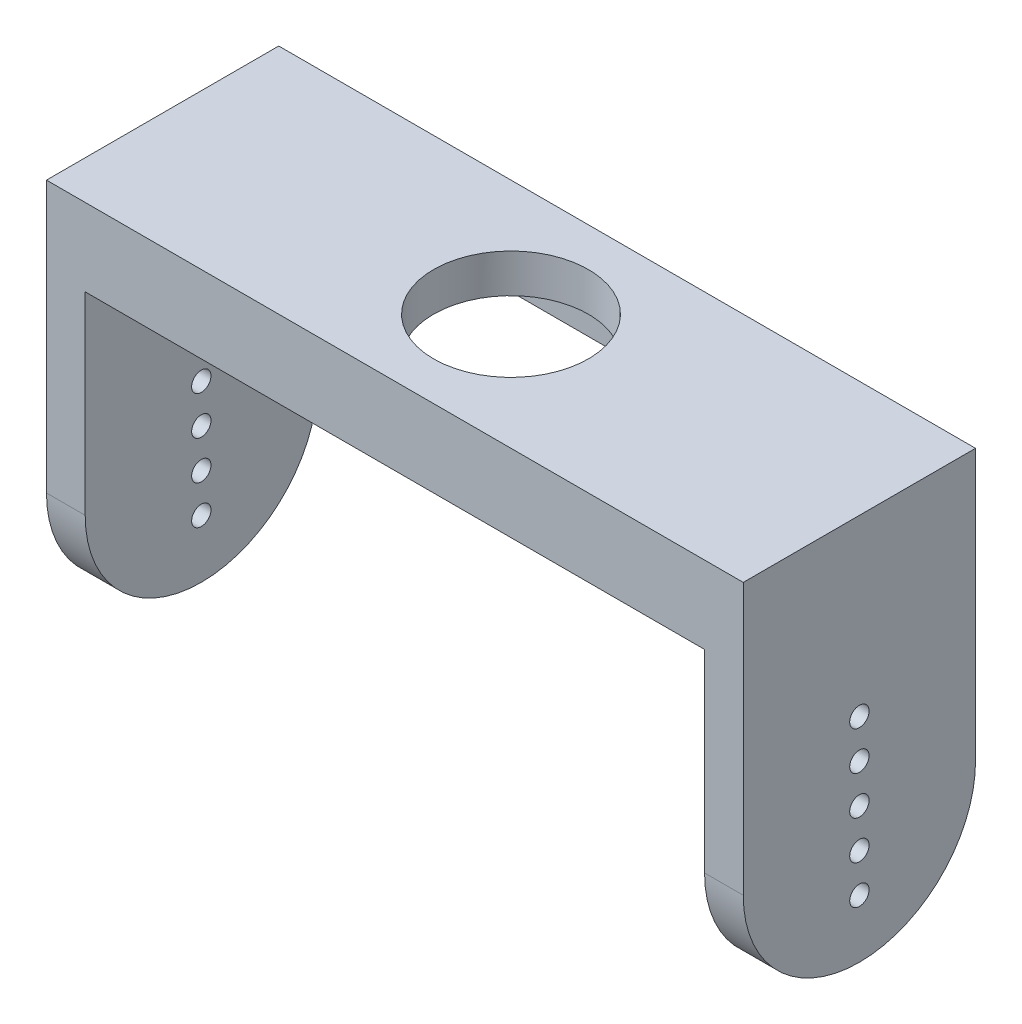
ISO-10303-21;
HEADER;
FILE_DESCRIPTION(('STEP AP214'),'2;1');
FILE_NAME('part.step','',(''),(''),'','','');
FILE_SCHEMA(('AUTOMOTIVE_DESIGN { 1 0 10303 214 1 1 1 1 }'));
ENDSEC;
DATA;
#1=APPLICATION_CONTEXT('core data for automotive mechanical design processes');
#2=APPLICATION_PROTOCOL_DEFINITION('international standard','automotive_design',2000,#1);
#3=PRODUCT_CONTEXT('',#1,'mechanical');
#4=PRODUCT('Part','Part','',(#3));
#5=PRODUCT_RELATED_PRODUCT_CATEGORY('part','',(#4));
#6=PRODUCT_DEFINITION_FORMATION('','',#4);
#7=PRODUCT_DEFINITION_CONTEXT('part definition',#1,'design');
#8=PRODUCT_DEFINITION('design','',#6,#7);
#9=PRODUCT_DEFINITION_SHAPE('','',#8);
#10=(LENGTH_UNIT() NAMED_UNIT(*) SI_UNIT(.MILLI.,.METRE.));
#11=(NAMED_UNIT(*) PLANE_ANGLE_UNIT() SI_UNIT($,.RADIAN.));
#12=(NAMED_UNIT(*) SI_UNIT($,.STERADIAN.) SOLID_ANGLE_UNIT());
#13=UNCERTAINTY_MEASURE_WITH_UNIT(LENGTH_MEASURE(1.E-05),#10,'distance_accuracy_value','');
#14=(GEOMETRIC_REPRESENTATION_CONTEXT(3) GLOBAL_UNCERTAINTY_ASSIGNED_CONTEXT((#13)) GLOBAL_UNIT_ASSIGNED_CONTEXT((#10,
#11,#12)) REPRESENTATION_CONTEXT('',''));
#15=CARTESIAN_POINT('',(0.,0.,0.));
#16=DIRECTION('',(0.,0.,1.));
#17=DIRECTION('',(1.,0.,0.));
#18=AXIS2_PLACEMENT_3D('',#15,#16,#17);
#19=CARTESIAN_POINT('',(16.,0.,0.));
#20=DIRECTION('',(1.,0.,0.));
#21=DIRECTION('',(0.,0.,-1.));
#22=AXIS2_PLACEMENT_3D('',#19,#20,#21);
#23=PLANE('',#22);
#24=CARTESIAN_POINT('',(16.,-4.99999999999999,6.));
#25=DIRECTION('',(1.,0.,0.));
#26=DIRECTION('',(0.,0.,-1.));
#27=AXIS2_PLACEMENT_3D('',#24,#25,#26);
#28=CIRCLE('',#27,0.500000000000002);
#29=CARTESIAN_POINT('',(16.,-4.99999999999999,5.5));
#30=VERTEX_POINT('',#29);
#31=EDGE_CURVE('E215',#30,#30,#28,.T.);
#32=ORIENTED_EDGE('',*,*,#31,.T.);
#33=EDGE_LOOP('',(#32));
#34=FACE_BOUND('',#33,.T.);
#35=CARTESIAN_POINT('',(16.,-2.99999999999999,6.));
#36=DIRECTION('',(1.,0.,0.));
#37=DIRECTION('',(0.,0.,-1.));
#38=AXIS2_PLACEMENT_3D('',#35,#36,#37);
#39=CIRCLE('',#38,0.500000000000002);
#40=CARTESIAN_POINT('',(16.,-2.99999999999999,5.5));
#41=VERTEX_POINT('',#40);
#42=EDGE_CURVE('E203',#41,#41,#39,.T.);
#43=ORIENTED_EDGE('',*,*,#42,.T.);
#44=EDGE_LOOP('',(#43));
#45=FACE_BOUND('',#44,.T.);
#46=CARTESIAN_POINT('',(16.,-0.999999999999992,6.));
#47=DIRECTION('',(1.,0.,0.));
#48=DIRECTION('',(0.,0.,-1.));
#49=AXIS2_PLACEMENT_3D('',#46,#47,#48);
#50=CIRCLE('',#49,0.500000000000002);
#51=CARTESIAN_POINT('',(16.,-0.999999999999992,5.5));
#52=VERTEX_POINT('',#51);
#53=EDGE_CURVE('E200',#52,#52,#50,.T.);
#54=ORIENTED_EDGE('',*,*,#53,.T.);
#55=EDGE_LOOP('',(#54));
#56=FACE_BOUND('',#55,.T.);
#57=CARTESIAN_POINT('',(16.,1.00000000000001,6.));
#58=DIRECTION('',(1.,0.,0.));
#59=DIRECTION('',(0.,0.,-1.));
#60=AXIS2_PLACEMENT_3D('',#57,#58,#59);
#61=CIRCLE('',#60,0.500000000000002);
#62=CARTESIAN_POINT('',(16.,1.00000000000001,5.5));
#63=VERTEX_POINT('',#62);
#64=EDGE_CURVE('E196',#63,#63,#61,.T.);
#65=ORIENTED_EDGE('',*,*,#64,.T.);
#66=EDGE_LOOP('',(#65));
#67=FACE_BOUND('',#66,.T.);
#68=CARTESIAN_POINT('',(16.,-6.99999999999999,6.));
#69=DIRECTION('',(1.,0.,0.));
#70=DIRECTION('',(0.,0.,-1.));
#71=AXIS2_PLACEMENT_3D('',#68,#69,#70);
#72=CIRCLE('',#71,0.500000000000002);
#73=CARTESIAN_POINT('',(16.,-6.99999999999999,5.5));
#74=VERTEX_POINT('',#73);
#75=EDGE_CURVE('E191',#74,#74,#72,.T.);
#76=ORIENTED_EDGE('',*,*,#75,.T.);
#77=EDGE_LOOP('',(#76));
#78=FACE_BOUND('',#77,.T.);
#79=DIRECTION('',(0.,1.,0.));
#80=VECTOR('',#79,1.);
#81=CARTESIAN_POINT('',(16.,6.,1.));
#82=LINE('',#81,#80);
#83=CARTESIAN_POINT('',(16.,6.,1.));
#84=VERTEX_POINT('',#83);
#85=CARTESIAN_POINT('',(16.,8.,1.));
#86=VERTEX_POINT('',#85);
#87=EDGE_CURVE('E244',#84,#86,#82,.T.);
#88=ORIENTED_EDGE('',*,*,#87,.F.);
#89=DIRECTION('',(0.,0.,1.));
#90=VECTOR('',#89,1.);
#91=CARTESIAN_POINT('',(16.,6.,1.));
#92=LINE('',#91,#90);
#93=CARTESIAN_POINT('',(16.,6.,0.));
#94=VERTEX_POINT('',#93);
#95=EDGE_CURVE('E135',#94,#84,#92,.T.);
#96=ORIENTED_EDGE('',*,*,#95,.F.);
#97=DIRECTION('',(0.,1.,0.));
#98=VECTOR('',#97,1.);
#99=CARTESIAN_POINT('',(16.,0.,0.));
#100=LINE('',#99,#98);
#101=CARTESIAN_POINT('',(16.,-3.99999999999999,0.));
#102=VERTEX_POINT('',#101);
#103=EDGE_CURVE('E132',#102,#94,#100,.T.);
#104=ORIENTED_EDGE('',*,*,#103,.F.);
#105=CARTESIAN_POINT('',(16.,-3.99999999999999,6.));
#106=DIRECTION('',(1.,0.,0.));
#107=DIRECTION('',(0.,0.,-1.));
#108=AXIS2_PLACEMENT_3D('',#105,#106,#107);
#109=CIRCLE('',#108,6.);
#110=CARTESIAN_POINT('',(16.,-3.99999999999999,12.));
#111=VERTEX_POINT('',#110);
#112=EDGE_CURVE('E159',#111,#102,#109,.T.);
#113=ORIENTED_EDGE('',*,*,#112,.F.);
#114=DIRECTION('',(0.,1.,0.));
#115=VECTOR('',#114,1.);
#116=CARTESIAN_POINT('',(16.,0.,12.));
#117=LINE('',#116,#115);
#118=CARTESIAN_POINT('',(16.,6.,12.));
#119=VERTEX_POINT('',#118);
#120=EDGE_CURVE('E157',#111,#119,#117,.T.);
#121=ORIENTED_EDGE('',*,*,#120,.T.);
#122=DIRECTION('',(0.,0.,1.));
#123=VECTOR('',#122,1.);
#124=CARTESIAN_POINT('',(16.,6.,12.));
#125=LINE('',#124,#123);
#126=CARTESIAN_POINT('',(16.,6.,11.));
#127=VERTEX_POINT('',#126);
#128=EDGE_CURVE('E49',#127,#119,#125,.T.);
#129=ORIENTED_EDGE('',*,*,#128,.F.);
#130=DIRECTION('',(0.,1.,0.));
#131=VECTOR('',#130,1.);
#132=CARTESIAN_POINT('',(16.,6.,11.));
#133=LINE('',#132,#131);
#134=CARTESIAN_POINT('',(16.,8.,11.));
#135=VERTEX_POINT('',#134);
#136=EDGE_CURVE('E262',#127,#135,#133,.T.);
#137=ORIENTED_EDGE('',*,*,#136,.T.);
#138=DIRECTION('',(0.,0.,1.));
#139=VECTOR('',#138,1.);
#140=CARTESIAN_POINT('',(16.,8.,0.));
#141=LINE('',#140,#139);
#142=EDGE_CURVE('E149',#86,#135,#141,.T.);
#143=ORIENTED_EDGE('',*,*,#142,.F.);
#144=EDGE_LOOP('',(#88,#96,#104,#113,#121,#129,#137,#143));
#145=FACE_BOUND('',#144,.T.);
#146=ADVANCED_FACE('F32',(#34,#45,#56,#67,#78,#145),#23,.F.);
#147=CARTESIAN_POINT('',(-16.,0.,0.));
#148=DIRECTION('',(-1.,0.,0.));
#149=DIRECTION('',(0.,-1.,0.));
#150=AXIS2_PLACEMENT_3D('',#147,#148,#149);
#151=PLANE('',#150);
#152=CARTESIAN_POINT('',(-16.,-4.99999999999999,6.));
#153=DIRECTION('',(-1.,0.,0.));
#154=DIRECTION('',(0.,-1.,0.));
#155=AXIS2_PLACEMENT_3D('',#152,#153,#154);
#156=CIRCLE('',#155,0.500000000000002);
#157=CARTESIAN_POINT('',(-16.,-5.49999999999999,6.));
#158=VERTEX_POINT('',#157);
#159=EDGE_CURVE('E36',#158,#158,#156,.T.);
#160=ORIENTED_EDGE('',*,*,#159,.T.);
#161=EDGE_LOOP('',(#160));
#162=FACE_BOUND('',#161,.T.);
#163=CARTESIAN_POINT('',(-16.,-2.99999999999999,6.));
#164=DIRECTION('',(-1.,0.,0.));
#165=DIRECTION('',(0.,-1.,0.));
#166=AXIS2_PLACEMENT_3D('',#163,#164,#165);
#167=CIRCLE('',#166,0.500000000000002);
#168=CARTESIAN_POINT('',(-16.,-3.49999999999999,6.));
#169=VERTEX_POINT('',#168);
#170=EDGE_CURVE('E201',#169,#169,#167,.T.);
#171=ORIENTED_EDGE('',*,*,#170,.T.);
#172=EDGE_LOOP('',(#171));
#173=FACE_BOUND('',#172,.T.);
#174=CARTESIAN_POINT('',(-16.,-0.999999999999992,6.));
#175=DIRECTION('',(-1.,0.,0.));
#176=DIRECTION('',(0.,-1.,0.));
#177=AXIS2_PLACEMENT_3D('',#174,#175,#176);
#178=CIRCLE('',#177,0.500000000000002);
#179=CARTESIAN_POINT('',(-16.,-1.49999999999999,6.));
#180=VERTEX_POINT('',#179);
#181=EDGE_CURVE('E198',#180,#180,#178,.T.);
#182=ORIENTED_EDGE('',*,*,#181,.T.);
#183=EDGE_LOOP('',(#182));
#184=FACE_BOUND('',#183,.T.);
#185=CARTESIAN_POINT('',(-16.,1.00000000000001,6.));
#186=DIRECTION('',(-1.,0.,0.));
#187=DIRECTION('',(0.,-1.,0.));
#188=AXIS2_PLACEMENT_3D('',#185,#186,#187);
#189=CIRCLE('',#188,0.500000000000002);
#190=CARTESIAN_POINT('',(-16.,0.500000000000006,6.));
#191=VERTEX_POINT('',#190);
#192=EDGE_CURVE('E193',#191,#191,#189,.T.);
#193=ORIENTED_EDGE('',*,*,#192,.T.);
#194=EDGE_LOOP('',(#193));
#195=FACE_BOUND('',#194,.T.);
#196=CARTESIAN_POINT('',(-16.,-6.99999999999999,6.));
#197=DIRECTION('',(-1.,0.,0.));
#198=DIRECTION('',(0.,-1.,0.));
#199=AXIS2_PLACEMENT_3D('',#196,#197,#198);
#200=CIRCLE('',#199,0.500000000000002);
#201=CARTESIAN_POINT('',(-16.,-7.49999999999999,6.));
#202=VERTEX_POINT('',#201);
#203=EDGE_CURVE('E188',#202,#202,#200,.T.);
#204=ORIENTED_EDGE('',*,*,#203,.T.);
#205=EDGE_LOOP('',(#204));
#206=FACE_BOUND('',#205,.T.);
#207=DIRECTION('',(0.,1.,0.));
#208=VECTOR('',#207,1.);
#209=CARTESIAN_POINT('',(-16.,6.,1.));
#210=LINE('',#209,#208);
#211=CARTESIAN_POINT('',(-16.,6.,1.));
#212=VERTEX_POINT('',#211);
#213=CARTESIAN_POINT('',(-16.,8.,1.));
#214=VERTEX_POINT('',#213);
#215=EDGE_CURVE('E246',#212,#214,#210,.T.);
#216=ORIENTED_EDGE('',*,*,#215,.T.);
#217=DIRECTION('',(0.,0.,1.));
#218=VECTOR('',#217,1.);
#219=CARTESIAN_POINT('',(-16.,8.,0.));
#220=LINE('',#219,#218);
#221=CARTESIAN_POINT('',(-16.,8.,11.));
#222=VERTEX_POINT('',#221);
#223=EDGE_CURVE('E151',#214,#222,#220,.T.);
#224=ORIENTED_EDGE('',*,*,#223,.T.);
#225=DIRECTION('',(0.,1.,0.));
#226=VECTOR('',#225,1.);
#227=CARTESIAN_POINT('',(-16.,6.,11.));
#228=LINE('',#227,#226);
#229=CARTESIAN_POINT('',(-16.,6.,11.));
#230=VERTEX_POINT('',#229);
#231=EDGE_CURVE('E57',#230,#222,#228,.T.);
#232=ORIENTED_EDGE('',*,*,#231,.F.);
#233=DIRECTION('',(0.,0.,-1.));
#234=VECTOR('',#233,1.);
#235=CARTESIAN_POINT('',(-16.,6.,12.));
#236=LINE('',#235,#234);
#237=CARTESIAN_POINT('',(-16.,6.,12.));
#238=VERTEX_POINT('',#237);
#239=EDGE_CURVE('E253',#238,#230,#236,.T.);
#240=ORIENTED_EDGE('',*,*,#239,.F.);
#241=DIRECTION('',(0.,-1.,0.));
#242=VECTOR('',#241,1.);
#243=CARTESIAN_POINT('',(-16.,0.,12.));
#244=LINE('',#243,#242);
#245=CARTESIAN_POINT('',(-16.,-3.99999999999999,12.));
#246=VERTEX_POINT('',#245);
#247=EDGE_CURVE('E153',#238,#246,#244,.T.);
#248=ORIENTED_EDGE('',*,*,#247,.T.);
#249=CARTESIAN_POINT('',(-16.,-3.99999999999999,6.));
#250=DIRECTION('',(-1.,0.,0.));
#251=DIRECTION('',(0.,-1.,0.));
#252=AXIS2_PLACEMENT_3D('',#249,#250,#251);
#253=CIRCLE('',#252,6.);
#254=CARTESIAN_POINT('',(-16.,-3.99999999999999,0.));
#255=VERTEX_POINT('',#254);
#256=EDGE_CURVE('E41',#255,#246,#253,.T.);
#257=ORIENTED_EDGE('',*,*,#256,.F.);
#258=DIRECTION('',(0.,-1.,0.));
#259=VECTOR('',#258,1.);
#260=CARTESIAN_POINT('',(-16.,0.,0.));
#261=LINE('',#260,#259);
#262=CARTESIAN_POINT('',(-16.,6.,0.));
#263=VERTEX_POINT('',#262);
#264=EDGE_CURVE('E128',#263,#255,#261,.T.);
#265=ORIENTED_EDGE('',*,*,#264,.F.);
#266=DIRECTION('',(0.,0.,-1.));
#267=VECTOR('',#266,1.);
#268=CARTESIAN_POINT('',(-16.,6.,1.));
#269=LINE('',#268,#267);
#270=EDGE_CURVE('E136',#212,#263,#269,.T.);
#271=ORIENTED_EDGE('',*,*,#270,.F.);
#272=EDGE_LOOP('',(#216,#224,#232,#240,#248,#257,#265,#271));
#273=FACE_BOUND('',#272,.T.);
#274=ADVANCED_FACE('F146',(#162,#173,#184,#195,#206,#273),#151,.F.);
#275=CARTESIAN_POINT('',(0.,8.,0.));
#276=DIRECTION('',(0.,1.,0.));
#277=DIRECTION('',(-1.,0.,0.));
#278=AXIS2_PLACEMENT_3D('',#275,#276,#277);
#279=PLANE('',#278);
#280=CARTESIAN_POINT('',(0.,8.,6.));
#281=DIRECTION('',(0.,1.,0.));
#282=DIRECTION('',(-1.,0.,0.));
#283=AXIS2_PLACEMENT_3D('',#280,#281,#282);
#284=CIRCLE('',#283,4.);
#285=CARTESIAN_POINT('',(-3.99999999999999,8.,6.));
#286=VERTEX_POINT('',#285);
#287=EDGE_CURVE('E183',#286,#286,#284,.T.);
#288=ORIENTED_EDGE('',*,*,#287,.T.);
#289=EDGE_LOOP('',(#288));
#290=FACE_BOUND('',#289,.T.);
#291=DIRECTION('',(-1.,0.,0.));
#292=VECTOR('',#291,1.);
#293=CARTESIAN_POINT('',(-16.,8.,1.));
#294=LINE('',#293,#292);
#295=EDGE_CURVE('E144',#86,#214,#294,.T.);
#296=ORIENTED_EDGE('',*,*,#295,.F.);
#297=ORIENTED_EDGE('',*,*,#142,.T.);
#298=DIRECTION('',(1.,0.,0.));
#299=VECTOR('',#298,1.);
#300=CARTESIAN_POINT('',(-16.,8.,11.));
#301=LINE('',#300,#299);
#302=EDGE_CURVE('E252',#222,#135,#301,.T.);
#303=ORIENTED_EDGE('',*,*,#302,.F.);
#304=ORIENTED_EDGE('',*,*,#223,.F.);
#305=EDGE_LOOP('',(#296,#297,#303,#304));
#306=FACE_BOUND('',#305,.T.);
#307=ADVANCED_FACE('F296',(#290,#306),#279,.F.);
#308=CARTESIAN_POINT('',(18.,10.,12.));
#309=DIRECTION('',(-1.,0.,0.));
#310=DIRECTION('',(0.,-1.,0.));
#311=AXIS2_PLACEMENT_3D('',#308,#309,#310);
#312=PLANE('',#311);
#313=CARTESIAN_POINT('',(18.,-4.99999999999999,6.));
#314=DIRECTION('',(1.,0.,0.));
#315=DIRECTION('',(0.,0.,-1.));
#316=AXIS2_PLACEMENT_3D('',#313,#314,#315);
#317=CIRCLE('',#316,0.500000000000002);
#318=CARTESIAN_POINT('',(18.,-4.99999999999999,5.5));
#319=VERTEX_POINT('',#318);
#320=EDGE_CURVE('E270',#319,#319,#317,.T.);
#321=ORIENTED_EDGE('',*,*,#320,.F.);
#322=EDGE_LOOP('',(#321));
#323=FACE_BOUND('',#322,.T.);
#324=CARTESIAN_POINT('',(18.,-2.99999999999999,6.));
#325=DIRECTION('',(1.,0.,0.));
#326=DIRECTION('',(0.,0.,-1.));
#327=AXIS2_PLACEMENT_3D('',#324,#325,#326);
#328=CIRCLE('',#327,0.500000000000002);
#329=CARTESIAN_POINT('',(18.,-2.99999999999999,5.5));
#330=VERTEX_POINT('',#329);
#331=EDGE_CURVE('E276',#330,#330,#328,.T.);
#332=ORIENTED_EDGE('',*,*,#331,.F.);
#333=EDGE_LOOP('',(#332));
#334=FACE_BOUND('',#333,.T.);
#335=CARTESIAN_POINT('',(18.,-0.999999999999992,6.));
#336=DIRECTION('',(1.,0.,0.));
#337=DIRECTION('',(0.,0.,-1.));
#338=AXIS2_PLACEMENT_3D('',#335,#336,#337);
#339=CIRCLE('',#338,0.500000000000002);
#340=CARTESIAN_POINT('',(18.,-0.999999999999992,5.5));
#341=VERTEX_POINT('',#340);
#342=EDGE_CURVE('E282',#341,#341,#339,.T.);
#343=ORIENTED_EDGE('',*,*,#342,.F.);
#344=EDGE_LOOP('',(#343));
#345=FACE_BOUND('',#344,.T.);
#346=CARTESIAN_POINT('',(18.,1.00000000000001,6.));
#347=DIRECTION('',(1.,0.,0.));
#348=DIRECTION('',(0.,0.,-1.));
#349=AXIS2_PLACEMENT_3D('',#346,#347,#348);
#350=CIRCLE('',#349,0.500000000000002);
#351=CARTESIAN_POINT('',(18.,1.00000000000001,5.5));
#352=VERTEX_POINT('',#351);
#353=EDGE_CURVE('E267',#352,#352,#350,.T.);
#354=ORIENTED_EDGE('',*,*,#353,.F.);
#355=EDGE_LOOP('',(#354));
#356=FACE_BOUND('',#355,.T.);
#357=CARTESIAN_POINT('',(18.,-6.99999999999999,6.));
#358=DIRECTION('',(1.,0.,0.));
#359=DIRECTION('',(0.,0.,-1.));
#360=AXIS2_PLACEMENT_3D('',#357,#358,#359);
#361=CIRCLE('',#360,0.500000000000002);
#362=CARTESIAN_POINT('',(18.,-6.99999999999999,5.5));
#363=VERTEX_POINT('',#362);
#364=EDGE_CURVE('E218',#363,#363,#361,.T.);
#365=ORIENTED_EDGE('',*,*,#364,.F.);
#366=EDGE_LOOP('',(#365));
#367=FACE_BOUND('',#366,.T.);
#368=CARTESIAN_POINT('',(18.,-3.99999999999999,6.));
#369=DIRECTION('',(1.,0.,0.));
#370=DIRECTION('',(0.,0.,-1.));
#371=AXIS2_PLACEMENT_3D('',#368,#369,#370);
#372=CIRCLE('',#371,6.);
#373=CARTESIAN_POINT('',(18.,-3.99999999999999,12.));
#374=VERTEX_POINT('',#373);
#375=CARTESIAN_POINT('',(18.,-3.99999999999999,0.));
#376=VERTEX_POINT('',#375);
#377=EDGE_CURVE('E228',#374,#376,#372,.T.);
#378=ORIENTED_EDGE('',*,*,#377,.T.);
#379=DIRECTION('',(0.,1.,0.));
#380=VECTOR('',#379,1.);
#381=CARTESIAN_POINT('',(18.,10.,0.));
#382=LINE('',#381,#380);
#383=CARTESIAN_POINT('',(18.,10.,0.));
#384=VERTEX_POINT('',#383);
#385=EDGE_CURVE('E161',#376,#384,#382,.T.);
#386=ORIENTED_EDGE('',*,*,#385,.T.);
#387=DIRECTION('',(0.,0.,-1.));
#388=VECTOR('',#387,1.);
#389=CARTESIAN_POINT('',(18.,10.,12.));
#390=LINE('',#389,#388);
#391=CARTESIAN_POINT('',(18.,10.,12.));
#392=VERTEX_POINT('',#391);
#393=EDGE_CURVE('E179',#392,#384,#390,.T.);
#394=ORIENTED_EDGE('',*,*,#393,.F.);
#395=DIRECTION('',(0.,1.,0.));
#396=VECTOR('',#395,1.);
#397=CARTESIAN_POINT('',(18.,10.,12.));
#398=LINE('',#397,#396);
#399=EDGE_CURVE('E163',#374,#392,#398,.T.);
#400=ORIENTED_EDGE('',*,*,#399,.F.);
#401=EDGE_LOOP('',(#378,#386,#394,#400));
#402=FACE_BOUND('',#401,.T.);
#403=ADVANCED_FACE('F34',(#323,#334,#345,#356,#367,#402),#312,.F.);
#404=CARTESIAN_POINT('',(-18.,10.,12.));
#405=DIRECTION('',(1.,0.,0.));
#406=DIRECTION('',(0.,1.,0.));
#407=AXIS2_PLACEMENT_3D('',#404,#405,#406);
#408=PLANE('',#407);
#409=CARTESIAN_POINT('',(-18.,-4.99999999999999,6.));
#410=DIRECTION('',(1.,0.,0.));
#411=DIRECTION('',(0.,0.,-1.));
#412=AXIS2_PLACEMENT_3D('',#409,#410,#411);
#413=CIRCLE('',#412,0.500000000000002);
#414=CARTESIAN_POINT('',(-18.,-4.99999999999999,5.5));
#415=VERTEX_POINT('',#414);
#416=EDGE_CURVE('E197',#415,#415,#413,.T.);
#417=ORIENTED_EDGE('',*,*,#416,.T.);
#418=EDGE_LOOP('',(#417));
#419=FACE_BOUND('',#418,.T.);
#420=CARTESIAN_POINT('',(-18.,-2.99999999999999,6.));
#421=DIRECTION('',(1.,0.,0.));
#422=DIRECTION('',(0.,0.,-1.));
#423=AXIS2_PLACEMENT_3D('',#420,#421,#422);
#424=CIRCLE('',#423,0.500000000000002);
#425=CARTESIAN_POINT('',(-18.,-2.99999999999999,5.5));
#426=VERTEX_POINT('',#425);
#427=EDGE_CURVE('E273',#426,#426,#424,.T.);
#428=ORIENTED_EDGE('',*,*,#427,.T.);
#429=EDGE_LOOP('',(#428));
#430=FACE_BOUND('',#429,.T.);
#431=CARTESIAN_POINT('',(-18.,-0.999999999999992,6.));
#432=DIRECTION('',(1.,0.,0.));
#433=DIRECTION('',(0.,0.,-1.));
#434=AXIS2_PLACEMENT_3D('',#431,#432,#433);
#435=CIRCLE('',#434,0.500000000000002);
#436=CARTESIAN_POINT('',(-18.,-0.999999999999992,5.5));
#437=VERTEX_POINT('',#436);
#438=EDGE_CURVE('E279',#437,#437,#435,.T.);
#439=ORIENTED_EDGE('',*,*,#438,.T.);
#440=EDGE_LOOP('',(#439));
#441=FACE_BOUND('',#440,.T.);
#442=CARTESIAN_POINT('',(-18.,1.00000000000001,6.));
#443=DIRECTION('',(1.,0.,0.));
#444=DIRECTION('',(0.,0.,-1.));
#445=AXIS2_PLACEMENT_3D('',#442,#443,#444);
#446=CIRCLE('',#445,0.500000000000002);
#447=CARTESIAN_POINT('',(-18.,1.00000000000001,5.5));
#448=VERTEX_POINT('',#447);
#449=EDGE_CURVE('E285',#448,#448,#446,.T.);
#450=ORIENTED_EDGE('',*,*,#449,.T.);
#451=EDGE_LOOP('',(#450));
#452=FACE_BOUND('',#451,.T.);
#453=CARTESIAN_POINT('',(-18.,-6.99999999999999,6.));
#454=DIRECTION('',(1.,0.,0.));
#455=DIRECTION('',(0.,0.,-1.));
#456=AXIS2_PLACEMENT_3D('',#453,#454,#455);
#457=CIRCLE('',#456,0.500000000000002);
#458=CARTESIAN_POINT('',(-18.,-6.99999999999999,5.5));
#459=VERTEX_POINT('',#458);
#460=EDGE_CURVE('E192',#459,#459,#457,.T.);
#461=ORIENTED_EDGE('',*,*,#460,.T.);
#462=EDGE_LOOP('',(#461));
#463=FACE_BOUND('',#462,.T.);
#464=DIRECTION('',(0.,-1.,0.));
#465=VECTOR('',#464,1.);
#466=CARTESIAN_POINT('',(-18.,10.,0.));
#467=LINE('',#466,#465);
#468=CARTESIAN_POINT('',(-18.,10.,0.));
#469=VERTEX_POINT('',#468);
#470=CARTESIAN_POINT('',(-18.,-3.99999999999999,0.));
#471=VERTEX_POINT('',#470);
#472=EDGE_CURVE('E166',#469,#471,#467,.T.);
#473=ORIENTED_EDGE('',*,*,#472,.T.);
#474=CARTESIAN_POINT('',(-18.,-3.99999999999999,6.));
#475=DIRECTION('',(1.,0.,0.));
#476=DIRECTION('',(0.,0.,-1.));
#477=AXIS2_PLACEMENT_3D('',#474,#475,#476);
#478=CIRCLE('',#477,6.);
#479=CARTESIAN_POINT('',(-18.,-3.99999999999999,12.));
#480=VERTEX_POINT('',#479);
#481=EDGE_CURVE('E229',#480,#471,#478,.T.);
#482=ORIENTED_EDGE('',*,*,#481,.F.);
#483=DIRECTION('',(0.,-1.,0.));
#484=VECTOR('',#483,1.);
#485=CARTESIAN_POINT('',(-18.,10.,12.));
#486=LINE('',#485,#484);
#487=CARTESIAN_POINT('',(-18.,10.,12.));
#488=VERTEX_POINT('',#487);
#489=EDGE_CURVE('E168',#488,#480,#486,.T.);
#490=ORIENTED_EDGE('',*,*,#489,.F.);
#491=DIRECTION('',(0.,0.,-1.));
#492=VECTOR('',#491,1.);
#493=CARTESIAN_POINT('',(-18.,10.,12.));
#494=LINE('',#493,#492);
#495=EDGE_CURVE('E171',#488,#469,#494,.T.);
#496=ORIENTED_EDGE('',*,*,#495,.T.);
#497=EDGE_LOOP('',(#473,#482,#490,#496));
#498=FACE_BOUND('',#497,.T.);
#499=ADVANCED_FACE('F295',(#419,#430,#441,#452,#463,#498),#408,.F.);
#500=CARTESIAN_POINT('',(0.,0.,0.));
#501=DIRECTION('',(0.,0.,1.));
#502=DIRECTION('',(1.,0.,0.));
#503=AXIS2_PLACEMENT_3D('',#500,#501,#502);
#504=PLANE('',#503);
#505=DIRECTION('',(1.,0.,0.));
#506=VECTOR('',#505,1.);
#507=CARTESIAN_POINT('',(-16.,6.,0.));
#508=LINE('',#507,#506);
#509=EDGE_CURVE('E123',#263,#94,#508,.T.);
#510=ORIENTED_EDGE('',*,*,#509,.F.);
#511=ORIENTED_EDGE('',*,*,#264,.T.);
#512=DIRECTION('',(1.,0.,0.));
#513=VECTOR('',#512,1.);
#514=CARTESIAN_POINT('',(-18.,-3.99999999999999,0.));
#515=LINE('',#514,#513);
#516=EDGE_CURVE('E186',#471,#255,#515,.T.);
#517=ORIENTED_EDGE('',*,*,#516,.F.);
#518=ORIENTED_EDGE('',*,*,#472,.F.);
#519=DIRECTION('',(-1.,0.,0.));
#520=VECTOR('',#519,1.);
#521=CARTESIAN_POINT('',(-18.,10.,0.));
#522=LINE('',#521,#520);
#523=EDGE_CURVE('E173',#384,#469,#522,.T.);
#524=ORIENTED_EDGE('',*,*,#523,.F.);
#525=ORIENTED_EDGE('',*,*,#385,.F.);
#526=DIRECTION('',(1.,0.,0.));
#527=VECTOR('',#526,1.);
#528=CARTESIAN_POINT('',(-18.,-3.99999999999999,0.));
#529=LINE('',#528,#527);
#530=EDGE_CURVE('E11',#102,#376,#529,.T.);
#531=ORIENTED_EDGE('',*,*,#530,.F.);
#532=ORIENTED_EDGE('',*,*,#103,.T.);
#533=EDGE_LOOP('',(#510,#511,#517,#518,#524,#525,#531,#532));
#534=FACE_BOUND('',#533,.T.);
#535=ADVANCED_FACE('F125',(#534),#504,.F.);
#536=CARTESIAN_POINT('',(0.,0.,12.));
#537=DIRECTION('',(0.,0.,1.));
#538=DIRECTION('',(1.,0.,0.));
#539=AXIS2_PLACEMENT_3D('',#536,#537,#538);
#540=PLANE('',#539);
#541=ORIENTED_EDGE('',*,*,#247,.F.);
#542=DIRECTION('',(-1.,0.,0.));
#543=VECTOR('',#542,1.);
#544=CARTESIAN_POINT('',(-16.,6.,12.));
#545=LINE('',#544,#543);
#546=EDGE_CURVE('E259',#119,#238,#545,.T.);
#547=ORIENTED_EDGE('',*,*,#546,.F.);
#548=ORIENTED_EDGE('',*,*,#120,.F.);
#549=DIRECTION('',(1.,0.,0.));
#550=VECTOR('',#549,1.);
#551=CARTESIAN_POINT('',(-18.,-3.99999999999999,12.));
#552=LINE('',#551,#550);
#553=EDGE_CURVE('E231',#111,#374,#552,.T.);
#554=ORIENTED_EDGE('',*,*,#553,.T.);
#555=ORIENTED_EDGE('',*,*,#399,.T.);
#556=DIRECTION('',(-1.,0.,0.));
#557=VECTOR('',#556,1.);
#558=CARTESIAN_POINT('',(-18.,10.,12.));
#559=LINE('',#558,#557);
#560=EDGE_CURVE('E165',#392,#488,#559,.T.);
#561=ORIENTED_EDGE('',*,*,#560,.T.);
#562=ORIENTED_EDGE('',*,*,#489,.T.);
#563=EDGE_CURVE('E233',#480,#246,#552,.T.);
#564=ORIENTED_EDGE('',*,*,#563,.T.);
#565=EDGE_LOOP('',(#541,#547,#548,#554,#555,#561,#562,#564));
#566=FACE_BOUND('',#565,.T.);
#567=ADVANCED_FACE('F304',(#566),#540,.T.);
#568=CARTESIAN_POINT('',(-18.,10.,12.));
#569=DIRECTION('',(0.,-1.,0.));
#570=DIRECTION('',(0.,0.,-1.));
#571=AXIS2_PLACEMENT_3D('',#568,#569,#570);
#572=PLANE('',#571);
#573=CARTESIAN_POINT('',(0.,10.,6.));
#574=DIRECTION('',(0.,1.,0.));
#575=DIRECTION('',(0.,0.,1.));
#576=AXIS2_PLACEMENT_3D('',#573,#574,#575);
#577=CIRCLE('',#576,4.);
#578=CARTESIAN_POINT('',(0.,10.,10.));
#579=VERTEX_POINT('',#578);
#580=EDGE_CURVE('E187',#579,#579,#577,.T.);
#581=ORIENTED_EDGE('',*,*,#580,.F.);
#582=EDGE_LOOP('',(#581));
#583=FACE_BOUND('',#582,.T.);
#584=ORIENTED_EDGE('',*,*,#523,.T.);
#585=ORIENTED_EDGE('',*,*,#495,.F.);
#586=ORIENTED_EDGE('',*,*,#560,.F.);
#587=ORIENTED_EDGE('',*,*,#393,.T.);
#588=EDGE_LOOP('',(#584,#585,#586,#587));
#589=FACE_BOUND('',#588,.T.);
#590=ADVANCED_FACE('F339',(#583,#589),#572,.F.);
#591=CARTESIAN_POINT('',(-18.,-3.99999999999999,6.));
#592=DIRECTION('',(1.,0.,0.));
#593=DIRECTION('',(0.,0.,-1.));
#594=AXIS2_PLACEMENT_3D('',#591,#592,#593);
#595=CYLINDRICAL_SURFACE('',#594,6.);
#596=ORIENTED_EDGE('',*,*,#256,.T.);
#597=ORIENTED_EDGE('',*,*,#563,.F.);
#598=ORIENTED_EDGE('',*,*,#481,.T.);
#599=ORIENTED_EDGE('',*,*,#516,.T.);
#600=EDGE_LOOP('',(#596,#597,#598,#599));
#601=FACE_BOUND('',#600,.T.);
#602=ADVANCED_FACE('F345',(#601),#595,.T.);
#603=ORIENTED_EDGE('',*,*,#112,.T.);
#604=ORIENTED_EDGE('',*,*,#530,.T.);
#605=ORIENTED_EDGE('',*,*,#377,.F.);
#606=ORIENTED_EDGE('',*,*,#553,.F.);
#607=EDGE_LOOP('',(#603,#604,#605,#606));
#608=FACE_BOUND('',#607,.T.);
#609=ADVANCED_FACE('F237',(#608),#595,.T.);
#610=CARTESIAN_POINT('',(0.,0.,6.));
#611=DIRECTION('',(0.,1.,0.));
#612=DIRECTION('',(0.,0.,1.));
#613=AXIS2_PLACEMENT_3D('',#610,#611,#612);
#614=CYLINDRICAL_SURFACE('',#613,4.);
#615=ORIENTED_EDGE('',*,*,#580,.T.);
#616=EDGE_LOOP('',(#615));
#617=FACE_BOUND('',#616,.T.);
#618=ORIENTED_EDGE('',*,*,#287,.F.);
#619=EDGE_LOOP('',(#618));
#620=FACE_BOUND('',#619,.T.);
#621=ADVANCED_FACE('F360',(#617,#620),#614,.F.);
#622=CARTESIAN_POINT('',(-18.,-6.99999999999999,6.));
#623=DIRECTION('',(1.,0.,0.));
#624=DIRECTION('',(0.,0.,-1.));
#625=AXIS2_PLACEMENT_3D('',#622,#623,#624);
#626=CYLINDRICAL_SURFACE('',#625,0.500000000000002);
#627=ORIENTED_EDGE('',*,*,#460,.F.);
#628=EDGE_LOOP('',(#627));
#629=FACE_BOUND('',#628,.T.);
#630=ORIENTED_EDGE('',*,*,#203,.F.);
#631=EDGE_LOOP('',(#630));
#632=FACE_BOUND('',#631,.T.);
#633=ADVANCED_FACE('F363',(#629,#632),#626,.F.);
#634=ORIENTED_EDGE('',*,*,#364,.T.);
#635=EDGE_LOOP('',(#634));
#636=FACE_BOUND('',#635,.T.);
#637=ORIENTED_EDGE('',*,*,#75,.F.);
#638=EDGE_LOOP('',(#637));
#639=FACE_BOUND('',#638,.T.);
#640=ADVANCED_FACE('F475',(#636,#639),#626,.F.);
#641=CARTESIAN_POINT('',(-18.,1.00000000000001,6.));
#642=DIRECTION('',(1.,0.,0.));
#643=DIRECTION('',(0.,0.,-1.));
#644=AXIS2_PLACEMENT_3D('',#641,#642,#643);
#645=CYLINDRICAL_SURFACE('',#644,0.500000000000002);
#646=ORIENTED_EDGE('',*,*,#449,.F.);
#647=EDGE_LOOP('',(#646));
#648=FACE_BOUND('',#647,.T.);
#649=ORIENTED_EDGE('',*,*,#192,.F.);
#650=EDGE_LOOP('',(#649));
#651=FACE_BOUND('',#650,.T.);
#652=ADVANCED_FACE('F451',(#648,#651),#645,.F.);
#653=CARTESIAN_POINT('',(-18.,-0.999999999999992,6.));
#654=DIRECTION('',(1.,0.,0.));
#655=DIRECTION('',(0.,0.,-1.));
#656=AXIS2_PLACEMENT_3D('',#653,#654,#655);
#657=CYLINDRICAL_SURFACE('',#656,0.500000000000002);
#658=ORIENTED_EDGE('',*,*,#438,.F.);
#659=EDGE_LOOP('',(#658));
#660=FACE_BOUND('',#659,.T.);
#661=ORIENTED_EDGE('',*,*,#181,.F.);
#662=EDGE_LOOP('',(#661));
#663=FACE_BOUND('',#662,.T.);
#664=ADVANCED_FACE('F444',(#660,#663),#657,.F.);
#665=CARTESIAN_POINT('',(-18.,-2.99999999999999,6.));
#666=DIRECTION('',(1.,0.,0.));
#667=DIRECTION('',(0.,0.,-1.));
#668=AXIS2_PLACEMENT_3D('',#665,#666,#667);
#669=CYLINDRICAL_SURFACE('',#668,0.500000000000002);
#670=ORIENTED_EDGE('',*,*,#427,.F.);
#671=EDGE_LOOP('',(#670));
#672=FACE_BOUND('',#671,.T.);
#673=ORIENTED_EDGE('',*,*,#170,.F.);
#674=EDGE_LOOP('',(#673));
#675=FACE_BOUND('',#674,.T.);
#676=ADVANCED_FACE('F436',(#672,#675),#669,.F.);
#677=CARTESIAN_POINT('',(-18.,-4.99999999999999,6.));
#678=DIRECTION('',(1.,0.,0.));
#679=DIRECTION('',(0.,0.,-1.));
#680=AXIS2_PLACEMENT_3D('',#677,#678,#679);
#681=CYLINDRICAL_SURFACE('',#680,0.500000000000002);
#682=ORIENTED_EDGE('',*,*,#416,.F.);
#683=EDGE_LOOP('',(#682));
#684=FACE_BOUND('',#683,.T.);
#685=ORIENTED_EDGE('',*,*,#159,.F.);
#686=EDGE_LOOP('',(#685));
#687=FACE_BOUND('',#686,.T.);
#688=ADVANCED_FACE('F427',(#684,#687),#681,.F.);
#689=ORIENTED_EDGE('',*,*,#353,.T.);
#690=EDGE_LOOP('',(#689));
#691=FACE_BOUND('',#690,.T.);
#692=ORIENTED_EDGE('',*,*,#64,.F.);
#693=EDGE_LOOP('',(#692));
#694=FACE_BOUND('',#693,.T.);
#695=ADVANCED_FACE('F290',(#691,#694),#645,.F.);
#696=ORIENTED_EDGE('',*,*,#342,.T.);
#697=EDGE_LOOP('',(#696));
#698=FACE_BOUND('',#697,.T.);
#699=ORIENTED_EDGE('',*,*,#53,.F.);
#700=EDGE_LOOP('',(#699));
#701=FACE_BOUND('',#700,.T.);
#702=ADVANCED_FACE('F433',(#698,#701),#657,.F.);
#703=ORIENTED_EDGE('',*,*,#331,.T.);
#704=EDGE_LOOP('',(#703));
#705=FACE_BOUND('',#704,.T.);
#706=ORIENTED_EDGE('',*,*,#42,.F.);
#707=EDGE_LOOP('',(#706));
#708=FACE_BOUND('',#707,.T.);
#709=ADVANCED_FACE('F424',(#705,#708),#669,.F.);
#710=ORIENTED_EDGE('',*,*,#320,.T.);
#711=EDGE_LOOP('',(#710));
#712=FACE_BOUND('',#711,.T.);
#713=ORIENTED_EDGE('',*,*,#31,.F.);
#714=EDGE_LOOP('',(#713));
#715=FACE_BOUND('',#714,.T.);
#716=ADVANCED_FACE('F400',(#712,#715),#681,.F.);
#717=CARTESIAN_POINT('',(-16.,6.,11.));
#718=DIRECTION('',(0.,0.,1.));
#719=DIRECTION('',(1.,0.,0.));
#720=AXIS2_PLACEMENT_3D('',#717,#718,#719);
#721=PLANE('',#720);
#722=ORIENTED_EDGE('',*,*,#302,.T.);
#723=ORIENTED_EDGE('',*,*,#136,.F.);
#724=DIRECTION('',(1.,0.,0.));
#725=VECTOR('',#724,1.);
#726=CARTESIAN_POINT('',(-16.,6.,11.));
#727=LINE('',#726,#725);
#728=EDGE_CURVE('E256',#230,#127,#727,.T.);
#729=ORIENTED_EDGE('',*,*,#728,.F.);
#730=ORIENTED_EDGE('',*,*,#231,.T.);
#731=EDGE_LOOP('',(#722,#723,#729,#730));
#732=FACE_BOUND('',#731,.T.);
#733=ADVANCED_FACE('F311',(#732),#721,.F.);
#734=CARTESIAN_POINT('',(0.,6.,0.));
#735=DIRECTION('',(0.,-1.,0.));
#736=DIRECTION('',(1.,0.,0.));
#737=AXIS2_PLACEMENT_3D('',#734,#735,#736);
#738=PLANE('',#737);
#739=ORIENTED_EDGE('',*,*,#239,.T.);
#740=ORIENTED_EDGE('',*,*,#728,.T.);
#741=ORIENTED_EDGE('',*,*,#128,.T.);
#742=ORIENTED_EDGE('',*,*,#546,.T.);
#743=EDGE_LOOP('',(#739,#740,#741,#742));
#744=FACE_BOUND('',#743,.T.);
#745=ADVANCED_FACE('F308',(#744),#738,.T.);
#746=CARTESIAN_POINT('',(-16.,6.,1.));
#747=DIRECTION('',(0.,0.,-1.));
#748=DIRECTION('',(-1.,0.,0.));
#749=AXIS2_PLACEMENT_3D('',#746,#747,#748);
#750=PLANE('',#749);
#751=ORIENTED_EDGE('',*,*,#295,.T.);
#752=ORIENTED_EDGE('',*,*,#215,.F.);
#753=DIRECTION('',(-1.,0.,0.));
#754=VECTOR('',#753,1.);
#755=CARTESIAN_POINT('',(-16.,6.,1.));
#756=LINE('',#755,#754);
#757=EDGE_CURVE('E141',#84,#212,#756,.T.);
#758=ORIENTED_EDGE('',*,*,#757,.F.);
#759=ORIENTED_EDGE('',*,*,#87,.T.);
#760=EDGE_LOOP('',(#751,#752,#758,#759));
#761=FACE_BOUND('',#760,.T.);
#762=ADVANCED_FACE('F317',(#761),#750,.F.);
#763=CARTESIAN_POINT('',(0.,6.,0.));
#764=DIRECTION('',(0.,-1.,0.));
#765=DIRECTION('',(1.,0.,0.));
#766=AXIS2_PLACEMENT_3D('',#763,#764,#765);
#767=PLANE('',#766);
#768=ORIENTED_EDGE('',*,*,#270,.T.);
#769=ORIENTED_EDGE('',*,*,#509,.T.);
#770=ORIENTED_EDGE('',*,*,#95,.T.);
#771=ORIENTED_EDGE('',*,*,#757,.T.);
#772=EDGE_LOOP('',(#768,#769,#770,#771));
#773=FACE_BOUND('',#772,.T.);
#774=ADVANCED_FACE('F139',(#773),#767,.T.);
#775=CLOSED_SHELL('',(#146,#274,#307,#403,#499,#535,#567,#590,#602,#609,#621,#633,#640,#652,
#664,#676,#688,#695,#702,#709,#716,#733,#745,#762,#774));
#776=MANIFOLD_SOLID_BREP('B2',#775);
#777=ADVANCED_BREP_SHAPE_REPRESENTATION('',(#18,#776),#14);
#778=SHAPE_DEFINITION_REPRESENTATION(#9,#777);
ENDSEC;
END-ISO-10303-21;
